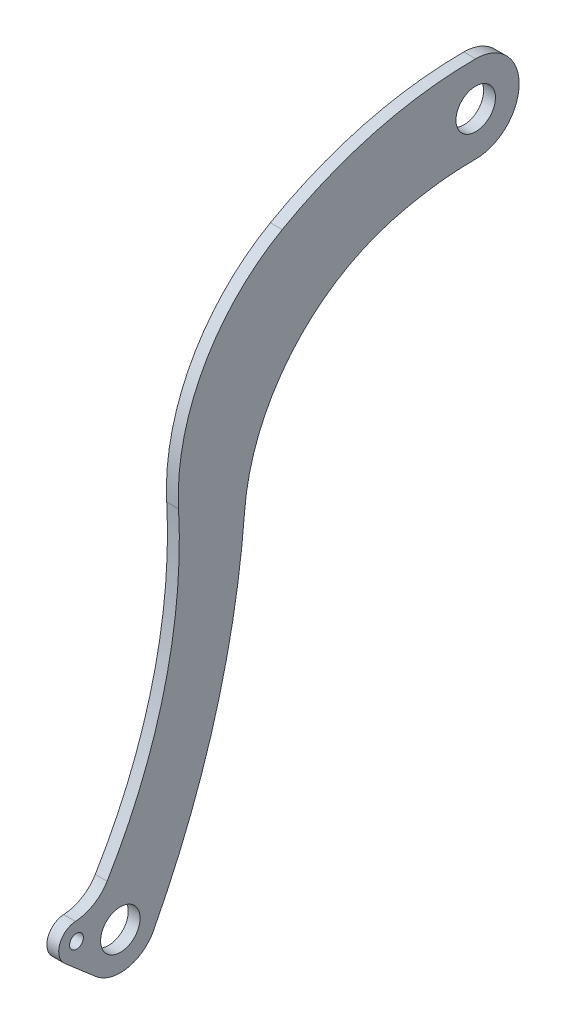
ISO-10303-21;
HEADER;
FILE_DESCRIPTION(('STEP AP214'),'2;1');
FILE_NAME('part.step','',(''),(''),'','','');
FILE_SCHEMA(('AUTOMOTIVE_DESIGN { 1 0 10303 214 1 1 1 1 }'));
ENDSEC;
DATA;
#1=APPLICATION_CONTEXT('core data for automotive mechanical design processes');
#2=APPLICATION_PROTOCOL_DEFINITION('international standard','automotive_design',2000,#1);
#3=PRODUCT_CONTEXT('',#1,'mechanical');
#4=PRODUCT('Part','Part','',(#3));
#5=PRODUCT_RELATED_PRODUCT_CATEGORY('part','',(#4));
#6=PRODUCT_DEFINITION_FORMATION('','',#4);
#7=PRODUCT_DEFINITION_CONTEXT('part definition',#1,'design');
#8=PRODUCT_DEFINITION('design','',#6,#7);
#9=PRODUCT_DEFINITION_SHAPE('','',#8);
#10=(LENGTH_UNIT() NAMED_UNIT(*) SI_UNIT(.MILLI.,.METRE.));
#11=(NAMED_UNIT(*) PLANE_ANGLE_UNIT() SI_UNIT($,.RADIAN.));
#12=(NAMED_UNIT(*) SI_UNIT($,.STERADIAN.) SOLID_ANGLE_UNIT());
#13=UNCERTAINTY_MEASURE_WITH_UNIT(LENGTH_MEASURE(1.E-05),#10,'distance_accuracy_value','');
#14=(GEOMETRIC_REPRESENTATION_CONTEXT(3) GLOBAL_UNCERTAINTY_ASSIGNED_CONTEXT((#13)) GLOBAL_UNIT_ASSIGNED_CONTEXT((#10,
#11,#12)) REPRESENTATION_CONTEXT('',''));
#15=CARTESIAN_POINT('',(0.,0.,0.));
#16=DIRECTION('',(0.,0.,1.));
#17=DIRECTION('',(1.,0.,0.));
#18=AXIS2_PLACEMENT_3D('',#15,#16,#17);
#19=CARTESIAN_POINT('',(1.5,-1.00000000000011,0.));
#20=DIRECTION('',(-1.,0.,0.));
#21=DIRECTION('',(0.,0.,1.));
#22=AXIS2_PLACEMENT_3D('',#19,#20,#21);
#23=CYLINDRICAL_SURFACE('',#22,80.0000000000001);
#24=CARTESIAN_POINT('',(-1.5,-1.00000000000011,0.));
#25=DIRECTION('',(-1.,0.,0.));
#26=DIRECTION('',(0.,0.,-1.));
#27=AXIS2_PLACEMENT_3D('',#24,#25,#26);
#28=CIRCLE('',#27,80.0000000000001);
#29=CARTESIAN_POINT('',(-1.5,76.1844516275808,21.0371202152204));
#30=VERTEX_POINT('',#29);
#31=CARTESIAN_POINT('',(-1.5,79.,0.));
#32=VERTEX_POINT('',#31);
#33=EDGE_CURVE('E163',#30,#32,#28,.T.);
#34=ORIENTED_EDGE('',*,*,#33,.T.);
#35=DIRECTION('',(-1.,0.,0.));
#36=VECTOR('',#35,1.);
#37=CARTESIAN_POINT('',(1.5,79.,0.));
#38=LINE('',#37,#36);
#39=CARTESIAN_POINT('',(1.5,79.,0.));
#40=VERTEX_POINT('',#39);
#41=EDGE_CURVE('E11',#40,#32,#38,.T.);
#42=ORIENTED_EDGE('',*,*,#41,.F.);
#43=CARTESIAN_POINT('',(1.5,-1.00000000000011,0.));
#44=DIRECTION('',(-1.,0.,0.));
#45=DIRECTION('',(0.,0.,-1.));
#46=AXIS2_PLACEMENT_3D('',#43,#44,#45);
#47=CIRCLE('',#46,80.0000000000001);
#48=CARTESIAN_POINT('',(1.5,76.1844516275808,21.0371202152204));
#49=VERTEX_POINT('',#48);
#50=EDGE_CURVE('E172',#49,#40,#47,.T.);
#51=ORIENTED_EDGE('',*,*,#50,.F.);
#52=DIRECTION('',(-1.,0.,0.));
#53=VECTOR('',#52,1.);
#54=CARTESIAN_POINT('',(1.5,76.1844516275808,21.0371202152204));
#55=LINE('',#54,#53);
#56=EDGE_CURVE('E189',#49,#30,#55,.T.);
#57=ORIENTED_EDGE('',*,*,#56,.T.);
#58=EDGE_LOOP('',(#34,#42,#51,#57));
#59=FACE_BOUND('',#58,.T.);
#60=ADVANCED_FACE('F37',(#59),#23,.F.);
#61=CARTESIAN_POINT('',(1.5,90.,0.));
#62=DIRECTION('',(-1.,0.,0.));
#63=DIRECTION('',(0.,0.,1.));
#64=AXIS2_PLACEMENT_3D('',#61,#62,#63);
#65=CYLINDRICAL_SURFACE('',#64,11.);
#66=CARTESIAN_POINT('',(-1.5,90.,0.));
#67=DIRECTION('',(1.,0.,0.));
#68=DIRECTION('',(0.,0.,-1.));
#69=AXIS2_PLACEMENT_3D('',#66,#67,#68);
#70=CIRCLE('',#69,11.);
#71=CARTESIAN_POINT('',(-1.5,101.,0.));
#72=VERTEX_POINT('',#71);
#73=EDGE_CURVE('E192',#32,#72,#70,.T.);
#74=ORIENTED_EDGE('',*,*,#73,.T.);
#75=DIRECTION('',(-1.,0.,0.));
#76=VECTOR('',#75,1.);
#77=CARTESIAN_POINT('',(1.5,101.,0.));
#78=LINE('',#77,#76);
#79=CARTESIAN_POINT('',(1.5,101.,0.));
#80=VERTEX_POINT('',#79);
#81=EDGE_CURVE('E44',#80,#72,#78,.T.);
#82=ORIENTED_EDGE('',*,*,#81,.F.);
#83=CARTESIAN_POINT('',(1.5,90.,0.));
#84=DIRECTION('',(1.,0.,0.));
#85=DIRECTION('',(0.,0.,-1.));
#86=AXIS2_PLACEMENT_3D('',#83,#84,#85);
#87=CIRCLE('',#86,11.);
#88=EDGE_CURVE('E175',#40,#80,#87,.T.);
#89=ORIENTED_EDGE('',*,*,#88,.F.);
#90=ORIENTED_EDGE('',*,*,#41,.T.);
#91=EDGE_LOOP('',(#74,#82,#89,#90));
#92=FACE_BOUND('',#91,.T.);
#93=ADVANCED_FACE('F258',(#92),#65,.T.);
#94=CARTESIAN_POINT('',(1.5,1.91977862819653,0.));
#95=DIRECTION('',(-1.,0.,0.));
#96=DIRECTION('',(0.,0.,1.));
#97=AXIS2_PLACEMENT_3D('',#94,#95,#96);
#98=CYLINDRICAL_SURFACE('',#97,99.0802213718032);
#99=CARTESIAN_POINT('',(-1.5,1.91977862819653,0.));
#100=DIRECTION('',(1.,0.,0.));
#101=DIRECTION('',(0.,0.,-1.));
#102=AXIS2_PLACEMENT_3D('',#99,#100,#101);
#103=CIRCLE('',#102,99.0802213718032);
#104=CARTESIAN_POINT('',(-1.5,88.0273434034063,49.0140546738238));
#105=VERTEX_POINT('',#104);
#106=EDGE_CURVE('E194',#72,#105,#103,.T.);
#107=ORIENTED_EDGE('',*,*,#106,.T.);
#108=DIRECTION('',(-1.,0.,0.));
#109=VECTOR('',#108,1.);
#110=CARTESIAN_POINT('',(1.5,88.0273434034063,49.0140546738238));
#111=LINE('',#110,#109);
#112=CARTESIAN_POINT('',(1.5,88.0273434034063,49.0140546738238));
#113=VERTEX_POINT('',#112);
#114=EDGE_CURVE('E216',#113,#105,#111,.T.);
#115=ORIENTED_EDGE('',*,*,#114,.F.);
#116=CARTESIAN_POINT('',(1.5,1.91977862819653,0.));
#117=DIRECTION('',(1.,0.,0.));
#118=DIRECTION('',(0.,0.,-1.));
#119=AXIS2_PLACEMENT_3D('',#116,#117,#118);
#120=CIRCLE('',#119,99.0802213718032);
#121=EDGE_CURVE('E178',#80,#113,#120,.T.);
#122=ORIENTED_EDGE('',*,*,#121,.F.);
#123=ORIENTED_EDGE('',*,*,#81,.T.);
#124=EDGE_LOOP('',(#107,#115,#122,#123));
#125=FACE_BOUND('',#124,.T.);
#126=ADVANCED_FACE('F223',(#125),#98,.T.);
#127=CARTESIAN_POINT('',(1.5,42.7648047154145,23.249761470075));
#128=DIRECTION('',(-1.,0.,0.));
#129=DIRECTION('',(0.,0.,1.));
#130=AXIS2_PLACEMENT_3D('',#127,#128,#129);
#131=CYLINDRICAL_SURFACE('',#130,52.081630281422);
#132=CARTESIAN_POINT('',(-1.5,42.7648047154145,23.249761470075));
#133=DIRECTION('',(1.,0.,0.));
#134=DIRECTION('',(0.,0.,-1.));
#135=AXIS2_PLACEMENT_3D('',#132,#133,#134);
#136=CIRCLE('',#135,52.081630281422);
#137=CARTESIAN_POINT('',(-1.5,39.8944297401121,75.2522341062093));
#138=VERTEX_POINT('',#137);
#139=EDGE_CURVE('E196',#105,#138,#136,.T.);
#140=ORIENTED_EDGE('',*,*,#139,.T.);
#141=DIRECTION('',(-1.,0.,0.));
#142=VECTOR('',#141,1.);
#143=CARTESIAN_POINT('',(1.5,39.8944297401121,75.2522341062093));
#144=LINE('',#143,#142);
#145=CARTESIAN_POINT('',(1.5,39.8944297401121,75.2522341062093));
#146=VERTEX_POINT('',#145);
#147=EDGE_CURVE('E213',#146,#138,#144,.T.);
#148=ORIENTED_EDGE('',*,*,#147,.F.);
#149=CARTESIAN_POINT('',(1.5,42.7648047154145,23.249761470075));
#150=DIRECTION('',(1.,0.,0.));
#151=DIRECTION('',(0.,0.,-1.));
#152=AXIS2_PLACEMENT_3D('',#149,#150,#151);
#153=CIRCLE('',#152,52.081630281422);
#154=EDGE_CURVE('E180',#113,#146,#153,.T.);
#155=ORIENTED_EDGE('',*,*,#154,.F.);
#156=ORIENTED_EDGE('',*,*,#114,.T.);
#157=EDGE_LOOP('',(#140,#148,#155,#156));
#158=FACE_BOUND('',#157,.T.);
#159=ADVANCED_FACE('F235',(#158),#131,.T.);
#160=CARTESIAN_POINT('',(1.5,32.9020765385807,201.932427165833));
#161=DIRECTION('',(-1.,0.,0.));
#162=DIRECTION('',(0.,0.,1.));
#163=AXIS2_PLACEMENT_3D('',#160,#161,#162);
#164=CYLINDRICAL_SURFACE('',#163,126.873024386267);
#165=CARTESIAN_POINT('',(-1.5,32.9020765385807,201.932427165833));
#166=DIRECTION('',(-1.,0.,0.));
#167=DIRECTION('',(0.,0.,1.));
#168=AXIS2_PLACEMENT_3D('',#165,#166,#167);
#169=CIRCLE('',#168,126.873024386267);
#170=CARTESIAN_POINT('',(-1.5,-32.7175933579479,93.3468699328891));
#171=VERTEX_POINT('',#170);
#172=EDGE_CURVE('E198',#138,#171,#169,.T.);
#173=ORIENTED_EDGE('',*,*,#172,.T.);
#174=DIRECTION('',(1.,0.,0.));
#175=VECTOR('',#174,1.);
#176=CARTESIAN_POINT('',(-24.5150064513261,-32.7175933579481,93.3468699328888));
#177=LINE('',#176,#175);
#178=CARTESIAN_POINT('',(1.5,-32.7175933579479,93.3468699328891));
#179=VERTEX_POINT('',#178);
#180=EDGE_CURVE('E59',#171,#179,#177,.T.);
#181=ORIENTED_EDGE('',*,*,#180,.T.);
#182=CARTESIAN_POINT('',(1.5,32.9020765385807,201.932427165833));
#183=DIRECTION('',(-1.,0.,0.));
#184=DIRECTION('',(0.,0.,1.));
#185=AXIS2_PLACEMENT_3D('',#182,#183,#184);
#186=CIRCLE('',#185,126.873024386267);
#187=EDGE_CURVE('E182',#146,#179,#186,.T.);
#188=ORIENTED_EDGE('',*,*,#187,.F.);
#189=ORIENTED_EDGE('',*,*,#147,.T.);
#190=EDGE_LOOP('',(#173,#181,#188,#189));
#191=FACE_BOUND('',#190,.T.);
#192=ADVANCED_FACE('F237',(#191),#164,.F.);
#193=CARTESIAN_POINT('',(1.5,-45.,90.));
#194=DIRECTION('',(-1.,0.,0.));
#195=DIRECTION('',(0.,0.,1.));
#196=AXIS2_PLACEMENT_3D('',#193,#194,#195);
#197=CYLINDRICAL_SURFACE('',#196,9.49999999999998);
#198=CARTESIAN_POINT('',(1.5,-45.,90.));
#199=DIRECTION('',(1.,0.,0.));
#200=DIRECTION('',(0.,0.,-1.));
#201=AXIS2_PLACEMENT_3D('',#198,#199,#200);
#202=CIRCLE('',#201,9.49999999999998);
#203=CARTESIAN_POINT('',(1.5,-52.1945440068848,96.203913001727));
#204=VERTEX_POINT('',#203);
#205=CARTESIAN_POINT('',(1.5,-49.3878025329469,81.5740170346799));
#206=VERTEX_POINT('',#205);
#207=EDGE_CURVE('E51',#204,#206,#202,.T.);
#208=ORIENTED_EDGE('',*,*,#207,.F.);
#209=DIRECTION('',(1.,0.,0.));
#210=VECTOR('',#209,1.);
#211=CARTESIAN_POINT('',(-24.5150064513261,-52.1945440068848,96.203913001727));
#212=LINE('',#211,#210);
#213=CARTESIAN_POINT('',(-1.5,-52.1945440068848,96.203913001727));
#214=VERTEX_POINT('',#213);
#215=EDGE_CURVE('E132',#214,#204,#212,.T.);
#216=ORIENTED_EDGE('',*,*,#215,.F.);
#217=CARTESIAN_POINT('',(-1.5,-45.,90.));
#218=DIRECTION('',(1.,0.,0.));
#219=DIRECTION('',(0.,0.,-1.));
#220=AXIS2_PLACEMENT_3D('',#217,#218,#219);
#221=CIRCLE('',#220,9.49999999999998);
#222=CARTESIAN_POINT('',(-1.5,-49.3878025329469,81.5740170346799));
#223=VERTEX_POINT('',#222);
#224=EDGE_CURVE('E200',#214,#223,#221,.T.);
#225=ORIENTED_EDGE('',*,*,#224,.T.);
#226=DIRECTION('',(-1.,0.,0.));
#227=VECTOR('',#226,1.);
#228=CARTESIAN_POINT('',(1.5,-49.3878025329469,81.5740170346799));
#229=LINE('',#228,#227);
#230=EDGE_CURVE('E210',#206,#223,#229,.T.);
#231=ORIENTED_EDGE('',*,*,#230,.F.);
#232=EDGE_LOOP('',(#208,#216,#225,#231));
#233=FACE_BOUND('',#232,.T.);
#234=ADVANCED_FACE('F245',(#233),#197,.T.);
#235=CARTESIAN_POINT('',(1.5,47.4099976930229,267.456724759156));
#236=DIRECTION('',(-1.,0.,0.));
#237=DIRECTION('',(0.,0.,1.));
#238=AXIS2_PLACEMENT_3D('',#235,#236,#237);
#239=CYLINDRICAL_SURFACE('',#238,209.576227563074);
#240=CARTESIAN_POINT('',(-1.5,47.4099976930229,267.456724759156));
#241=DIRECTION('',(1.,0.,0.));
#242=DIRECTION('',(0.,0.,1.));
#243=AXIS2_PLACEMENT_3D('',#240,#241,#242);
#244=CIRCLE('',#243,209.576227563074);
#245=CARTESIAN_POINT('',(-1.5,30.9171877623671,58.5304641307682));
#246=VERTEX_POINT('',#245);
#247=EDGE_CURVE('E202',#223,#246,#244,.T.);
#248=ORIENTED_EDGE('',*,*,#247,.T.);
#249=DIRECTION('',(-1.,0.,0.));
#250=VECTOR('',#249,1.);
#251=CARTESIAN_POINT('',(1.5,30.9171877623671,58.5304641307682));
#252=LINE('',#251,#250);
#253=CARTESIAN_POINT('',(1.5,30.9171877623671,58.5304641307682));
#254=VERTEX_POINT('',#253);
#255=EDGE_CURVE('E207',#254,#246,#252,.T.);
#256=ORIENTED_EDGE('',*,*,#255,.F.);
#257=CARTESIAN_POINT('',(1.5,47.4099976930229,267.456724759156));
#258=DIRECTION('',(1.,0.,0.));
#259=DIRECTION('',(0.,0.,1.));
#260=AXIS2_PLACEMENT_3D('',#257,#258,#259);
#261=CIRCLE('',#260,209.576227563074);
#262=EDGE_CURVE('E185',#206,#254,#261,.T.);
#263=ORIENTED_EDGE('',*,*,#262,.F.);
#264=ORIENTED_EDGE('',*,*,#230,.T.);
#265=EDGE_LOOP('',(#248,#256,#263,#264));
#266=FACE_BOUND('',#265,.T.);
#267=ADVANCED_FACE('F247',(#266),#239,.T.);
#268=CARTESIAN_POINT('',(1.5,26.8969715166799,7.60349955284603));
#269=DIRECTION('',(-1.,0.,0.));
#270=DIRECTION('',(0.,0.,1.));
#271=AXIS2_PLACEMENT_3D('',#268,#269,#270);
#272=CYLINDRICAL_SURFACE('',#271,51.0853977158153);
#273=CARTESIAN_POINT('',(-1.5,26.8969715166799,7.60349955284603));
#274=DIRECTION('',(-1.,0.,0.));
#275=DIRECTION('',(0.,0.,-1.));
#276=AXIS2_PLACEMENT_3D('',#273,#274,#275);
#277=CIRCLE('',#276,51.0853977158153);
#278=EDGE_CURVE('E176',#246,#30,#277,.T.);
#279=ORIENTED_EDGE('',*,*,#278,.T.);
#280=ORIENTED_EDGE('',*,*,#56,.F.);
#281=CARTESIAN_POINT('',(1.5,26.8969715166799,7.60349955284603));
#282=DIRECTION('',(-1.,0.,0.));
#283=DIRECTION('',(0.,0.,-1.));
#284=AXIS2_PLACEMENT_3D('',#281,#282,#283);
#285=CIRCLE('',#284,51.0853977158153);
#286=EDGE_CURVE('E187',#254,#49,#285,.T.);
#287=ORIENTED_EDGE('',*,*,#286,.F.);
#288=ORIENTED_EDGE('',*,*,#255,.T.);
#289=EDGE_LOOP('',(#279,#280,#287,#288));
#290=FACE_BOUND('',#289,.T.);
#291=ADVANCED_FACE('F253',(#290),#272,.F.);
#292=CARTESIAN_POINT('',(1.5,12.9484857583399,3.80174977642301));
#293=DIRECTION('',(1.,0.,0.));
#294=DIRECTION('',(0.,0.,-1.));
#295=AXIS2_PLACEMENT_3D('',#292,#293,#294);
#296=PLANE('',#295);
#297=ORIENTED_EDGE('',*,*,#187,.T.);
#298=CARTESIAN_POINT('',(1.5,-27.5455191353972,101.905470766928));
#299=DIRECTION('',(-1.,0.,0.));
#300=DIRECTION('',(0.,0.,-1.));
#301=AXIS2_PLACEMENT_3D('',#298,#299,#300);
#302=CIRCLE('',#301,10.);
#303=CARTESIAN_POINT('',(1.5,-37.5303893739654,101.355592308581));
#304=VERTEX_POINT('',#303);
#305=EDGE_CURVE('E133',#179,#304,#302,.T.);
#306=ORIENTED_EDGE('',*,*,#305,.T.);
#307=CARTESIAN_POINT('',(1.5,-42.0235809813211,101.108147002324));
#308=DIRECTION('',(1.,0.,0.));
#309=DIRECTION('',(0.,0.,-1.));
#310=AXIS2_PLACEMENT_3D('',#307,#308,#309);
#311=CIRCLE('',#310,4.49999999999999);
#312=CARTESIAN_POINT('',(1.5,-45.4315228793191,104.046842634721));
#313=VERTEX_POINT('',#312);
#314=EDGE_CURVE('E127',#304,#313,#311,.T.);
#315=ORIENTED_EDGE('',*,*,#314,.T.);
#316=DIRECTION('',(0.,-0.653043473866,-0.757320421777353));
#317=VECTOR('',#316,1.);
#318=CARTESIAN_POINT('',(1.5,-45.4315228793191,104.046842634721));
#319=LINE('',#318,#317);
#320=EDGE_CURVE('E136',#313,#204,#319,.T.);
#321=ORIENTED_EDGE('',*,*,#320,.T.);
#322=ORIENTED_EDGE('',*,*,#207,.T.);
#323=ORIENTED_EDGE('',*,*,#262,.T.);
#324=ORIENTED_EDGE('',*,*,#286,.T.);
#325=ORIENTED_EDGE('',*,*,#50,.T.);
#326=ORIENTED_EDGE('',*,*,#88,.T.);
#327=ORIENTED_EDGE('',*,*,#121,.T.);
#328=ORIENTED_EDGE('',*,*,#154,.T.);
#329=EDGE_LOOP('',(#297,#306,#315,#321,#322,#323,#324,#325,#326,#327,#328));
#330=FACE_BOUND('',#329,.T.);
#331=CARTESIAN_POINT('',(1.5,-45.,90.));
#332=DIRECTION('',(1.,0.,0.));
#333=DIRECTION('',(0.,0.,-1.));
#334=AXIS2_PLACEMENT_3D('',#331,#332,#333);
#335=CIRCLE('',#334,5.00000000000001);
#336=CARTESIAN_POINT('',(1.5,-45.,85.));
#337=VERTEX_POINT('',#336);
#338=EDGE_CURVE('E158',#337,#337,#335,.T.);
#339=ORIENTED_EDGE('',*,*,#338,.F.);
#340=EDGE_LOOP('',(#339));
#341=FACE_BOUND('',#340,.T.);
#342=CARTESIAN_POINT('',(1.5,90.,0.));
#343=DIRECTION('',(1.,0.,0.));
#344=DIRECTION('',(0.,0.,-1.));
#345=AXIS2_PLACEMENT_3D('',#342,#343,#344);
#346=CIRCLE('',#345,5.);
#347=CARTESIAN_POINT('',(1.5,90.,-5.));
#348=VERTEX_POINT('',#347);
#349=EDGE_CURVE('E164',#348,#348,#346,.T.);
#350=ORIENTED_EDGE('',*,*,#349,.F.);
#351=EDGE_LOOP('',(#350));
#352=FACE_BOUND('',#351,.T.);
#353=CARTESIAN_POINT('',(1.5,-42.0235809813211,101.108147002324));
#354=DIRECTION('',(1.,0.,0.));
#355=DIRECTION('',(0.,0.,-1.));
#356=AXIS2_PLACEMENT_3D('',#353,#354,#355);
#357=CIRCLE('',#356,1.75);
#358=CARTESIAN_POINT('',(1.5,-42.0235809813211,99.3581470023243));
#359=VERTEX_POINT('',#358);
#360=EDGE_CURVE('E143',#359,#359,#357,.T.);
#361=ORIENTED_EDGE('',*,*,#360,.F.);
#362=EDGE_LOOP('',(#361));
#363=FACE_BOUND('',#362,.T.);
#364=ADVANCED_FACE('F140',(#330,#341,#352,#363),#296,.T.);
#365=CARTESIAN_POINT('',(-1.5,12.9484857583399,3.80174977642301));
#366=DIRECTION('',(1.,0.,0.));
#367=DIRECTION('',(0.,0.,-1.));
#368=AXIS2_PLACEMENT_3D('',#365,#366,#367);
#369=PLANE('',#368);
#370=CARTESIAN_POINT('',(-1.5,-27.5455191353972,101.905470766928));
#371=DIRECTION('',(1.,0.,0.));
#372=DIRECTION('',(0.,0.,-1.));
#373=AXIS2_PLACEMENT_3D('',#370,#371,#372);
#374=CIRCLE('',#373,10.);
#375=CARTESIAN_POINT('',(-1.5,-37.5303893739654,101.355592308581));
#376=VERTEX_POINT('',#375);
#377=EDGE_CURVE('E152',#376,#171,#374,.T.);
#378=ORIENTED_EDGE('',*,*,#377,.T.);
#379=ORIENTED_EDGE('',*,*,#172,.F.);
#380=ORIENTED_EDGE('',*,*,#139,.F.);
#381=ORIENTED_EDGE('',*,*,#106,.F.);
#382=ORIENTED_EDGE('',*,*,#73,.F.);
#383=ORIENTED_EDGE('',*,*,#33,.F.);
#384=ORIENTED_EDGE('',*,*,#278,.F.);
#385=ORIENTED_EDGE('',*,*,#247,.F.);
#386=ORIENTED_EDGE('',*,*,#224,.F.);
#387=DIRECTION('',(0.,0.653043473866,0.757320421777353));
#388=VECTOR('',#387,1.);
#389=CARTESIAN_POINT('',(-1.5,-45.4315228793191,104.046842634721));
#390=LINE('',#389,#388);
#391=CARTESIAN_POINT('',(-1.5,-45.4315228793191,104.046842634721));
#392=VERTEX_POINT('',#391);
#393=EDGE_CURVE('E159',#214,#392,#390,.T.);
#394=ORIENTED_EDGE('',*,*,#393,.T.);
#395=CARTESIAN_POINT('',(-1.5,-42.0235809813211,101.108147002324));
#396=DIRECTION('',(1.,0.,0.));
#397=DIRECTION('',(0.,0.,-1.));
#398=AXIS2_PLACEMENT_3D('',#395,#396,#397);
#399=CIRCLE('',#398,4.49999999999999);
#400=EDGE_CURVE('E129',#392,#376,#399,.F.);
#401=ORIENTED_EDGE('',*,*,#400,.T.);
#402=EDGE_LOOP('',(#378,#379,#380,#381,#382,#383,#384,#385,#386,#394,#401));
#403=FACE_BOUND('',#402,.T.);
#404=CARTESIAN_POINT('',(-1.5,90.,0.));
#405=DIRECTION('',(1.,0.,0.));
#406=DIRECTION('',(0.,0.,-1.));
#407=AXIS2_PLACEMENT_3D('',#404,#405,#406);
#408=CIRCLE('',#407,5.);
#409=CARTESIAN_POINT('',(-1.5,90.,-5.));
#410=VERTEX_POINT('',#409);
#411=EDGE_CURVE('E160',#410,#410,#408,.T.);
#412=ORIENTED_EDGE('',*,*,#411,.T.);
#413=EDGE_LOOP('',(#412));
#414=FACE_BOUND('',#413,.T.);
#415=CARTESIAN_POINT('',(-1.5,-45.,90.));
#416=DIRECTION('',(1.,0.,0.));
#417=DIRECTION('',(0.,0.,-1.));
#418=AXIS2_PLACEMENT_3D('',#415,#416,#417);
#419=CIRCLE('',#418,5.00000000000001);
#420=CARTESIAN_POINT('',(-1.5,-45.,85.));
#421=VERTEX_POINT('',#420);
#422=EDGE_CURVE('E167',#421,#421,#419,.T.);
#423=ORIENTED_EDGE('',*,*,#422,.T.);
#424=EDGE_LOOP('',(#423));
#425=FACE_BOUND('',#424,.T.);
#426=CARTESIAN_POINT('',(-1.5,-42.0235809813211,101.108147002324));
#427=DIRECTION('',(1.,0.,0.));
#428=DIRECTION('',(0.,0.,-1.));
#429=AXIS2_PLACEMENT_3D('',#426,#427,#428);
#430=CIRCLE('',#429,1.75);
#431=CARTESIAN_POINT('',(-1.5,-42.0235809813211,99.3581470023243));
#432=VERTEX_POINT('',#431);
#433=EDGE_CURVE('E155',#432,#432,#430,.F.);
#434=ORIENTED_EDGE('',*,*,#433,.F.);
#435=EDGE_LOOP('',(#434));
#436=FACE_BOUND('',#435,.T.);
#437=ADVANCED_FACE('F229',(#403,#414,#425,#436),#369,.F.);
#438=CARTESIAN_POINT('',(-1.5,-45.,90.));
#439=DIRECTION('',(1.,0.,0.));
#440=DIRECTION('',(0.,0.,-1.));
#441=AXIS2_PLACEMENT_3D('',#438,#439,#440);
#442=CYLINDRICAL_SURFACE('',#441,5.00000000000001);
#443=ORIENTED_EDGE('',*,*,#422,.F.);
#444=EDGE_LOOP('',(#443));
#445=FACE_BOUND('',#444,.T.);
#446=ORIENTED_EDGE('',*,*,#338,.T.);
#447=EDGE_LOOP('',(#446));
#448=FACE_BOUND('',#447,.T.);
#449=ADVANCED_FACE('F278',(#445,#448),#442,.F.);
#450=CARTESIAN_POINT('',(-1.5,90.,0.));
#451=DIRECTION('',(1.,0.,0.));
#452=DIRECTION('',(0.,0.,-1.));
#453=AXIS2_PLACEMENT_3D('',#450,#451,#452);
#454=CYLINDRICAL_SURFACE('',#453,5.);
#455=ORIENTED_EDGE('',*,*,#411,.F.);
#456=EDGE_LOOP('',(#455));
#457=FACE_BOUND('',#456,.T.);
#458=ORIENTED_EDGE('',*,*,#349,.T.);
#459=EDGE_LOOP('',(#458));
#460=FACE_BOUND('',#459,.T.);
#461=ADVANCED_FACE('F282',(#457,#460),#454,.F.);
#462=CARTESIAN_POINT('',(-24.5150064513261,-45.4315228793191,104.046842634721));
#463=DIRECTION('',(0.,-0.757320421777353,0.653043473866));
#464=DIRECTION('',(0.,-0.653043473866,-0.757320421777353));
#465=AXIS2_PLACEMENT_3D('',#462,#463,#464);
#466=PLANE('',#465);
#467=ORIENTED_EDGE('',*,*,#393,.F.);
#468=ORIENTED_EDGE('',*,*,#215,.T.);
#469=ORIENTED_EDGE('',*,*,#320,.F.);
#470=DIRECTION('',(1.,0.,0.));
#471=VECTOR('',#470,1.);
#472=CARTESIAN_POINT('',(-24.5150064513261,-45.4315228793191,104.046842634721));
#473=LINE('',#472,#471);
#474=EDGE_CURVE('E122',#392,#313,#473,.T.);
#475=ORIENTED_EDGE('',*,*,#474,.F.);
#476=EDGE_LOOP('',(#467,#468,#469,#475));
#477=FACE_BOUND('',#476,.T.);
#478=ADVANCED_FACE('F137',(#477),#466,.T.);
#479=CARTESIAN_POINT('',(-24.5150064513261,-27.5455191353972,101.905470766928));
#480=DIRECTION('',(1.,0.,0.));
#481=DIRECTION('',(0.,0.,-1.));
#482=AXIS2_PLACEMENT_3D('',#479,#480,#481);
#483=CYLINDRICAL_SURFACE('',#482,10.);
#484=ORIENTED_EDGE('',*,*,#377,.F.);
#485=DIRECTION('',(1.,0.,0.));
#486=VECTOR('',#485,1.);
#487=CARTESIAN_POINT('',(-24.5150064513261,-37.5303893739654,101.355592308581));
#488=LINE('',#487,#486);
#489=EDGE_CURVE('E150',#376,#304,#488,.T.);
#490=ORIENTED_EDGE('',*,*,#489,.T.);
#491=ORIENTED_EDGE('',*,*,#305,.F.);
#492=ORIENTED_EDGE('',*,*,#180,.F.);
#493=EDGE_LOOP('',(#484,#490,#491,#492));
#494=FACE_BOUND('',#493,.T.);
#495=ADVANCED_FACE('F240',(#494),#483,.F.);
#496=CARTESIAN_POINT('',(-24.5150064513261,-42.0235809813211,101.108147002324));
#497=DIRECTION('',(1.,0.,0.));
#498=DIRECTION('',(0.,0.,-1.));
#499=AXIS2_PLACEMENT_3D('',#496,#497,#498);
#500=CYLINDRICAL_SURFACE('',#499,4.49999999999999);
#501=ORIENTED_EDGE('',*,*,#400,.F.);
#502=ORIENTED_EDGE('',*,*,#474,.T.);
#503=ORIENTED_EDGE('',*,*,#314,.F.);
#504=ORIENTED_EDGE('',*,*,#489,.F.);
#505=EDGE_LOOP('',(#501,#502,#503,#504));
#506=FACE_BOUND('',#505,.T.);
#507=ADVANCED_FACE('F124',(#506),#500,.T.);
#508=CARTESIAN_POINT('',(-24.5150064513261,-42.0235809813211,101.108147002324));
#509=DIRECTION('',(1.,0.,0.));
#510=DIRECTION('',(0.,0.,-1.));
#511=AXIS2_PLACEMENT_3D('',#508,#509,#510);
#512=CYLINDRICAL_SURFACE('',#511,1.75);
#513=ORIENTED_EDGE('',*,*,#433,.T.);
#514=EDGE_LOOP('',(#513));
#515=FACE_BOUND('',#514,.T.);
#516=ORIENTED_EDGE('',*,*,#360,.T.);
#517=EDGE_LOOP('',(#516));
#518=FACE_BOUND('',#517,.T.);
#519=ADVANCED_FACE('F289',(#515,#518),#512,.F.);
#520=CLOSED_SHELL('',(#60,#93,#126,#159,#192,#234,#267,#291,#364,#437,#449,#461,#478,#495,#507,#519));
#521=MANIFOLD_SOLID_BREP('B2',#520);
#522=ADVANCED_BREP_SHAPE_REPRESENTATION('',(#18,#521),#14);
#523=SHAPE_DEFINITION_REPRESENTATION(#9,#522);
ENDSEC;
END-ISO-10303-21;
